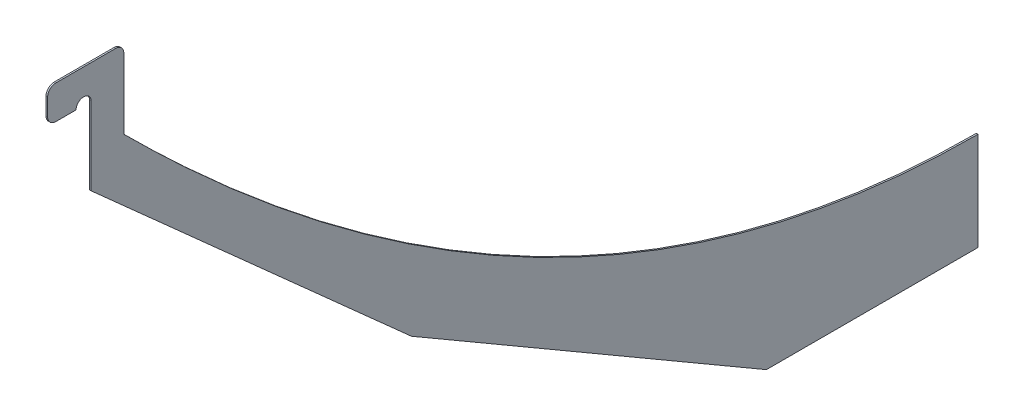
ISO-10303-21;
HEADER;
FILE_DESCRIPTION(('STEP AP214'),'2;1');
FILE_NAME('part.step','',(''),(''),'','','');
FILE_SCHEMA(('AUTOMOTIVE_DESIGN { 1 0 10303 214 1 1 1 1 }'));
ENDSEC;
DATA;
#1=APPLICATION_CONTEXT('core data for automotive mechanical design processes');
#2=APPLICATION_PROTOCOL_DEFINITION('international standard','automotive_design',2000,#1);
#3=PRODUCT_CONTEXT('',#1,'mechanical');
#4=PRODUCT('Part','Part','',(#3));
#5=PRODUCT_RELATED_PRODUCT_CATEGORY('part','',(#4));
#6=PRODUCT_DEFINITION_FORMATION('','',#4);
#7=PRODUCT_DEFINITION_CONTEXT('part definition',#1,'design');
#8=PRODUCT_DEFINITION('design','',#6,#7);
#9=PRODUCT_DEFINITION_SHAPE('','',#8);
#10=(LENGTH_UNIT() NAMED_UNIT(*) SI_UNIT(.MILLI.,.METRE.));
#11=(NAMED_UNIT(*) PLANE_ANGLE_UNIT() SI_UNIT($,.RADIAN.));
#12=(NAMED_UNIT(*) SI_UNIT($,.STERADIAN.) SOLID_ANGLE_UNIT());
#13=UNCERTAINTY_MEASURE_WITH_UNIT(LENGTH_MEASURE(1.E-05),#10,'distance_accuracy_value','');
#14=(GEOMETRIC_REPRESENTATION_CONTEXT(3) GLOBAL_UNCERTAINTY_ASSIGNED_CONTEXT((#13)) GLOBAL_UNIT_ASSIGNED_CONTEXT((#10,
#11,#12)) REPRESENTATION_CONTEXT('',''));
#15=CARTESIAN_POINT('',(0.,0.,0.));
#16=DIRECTION('',(0.,0.,1.));
#17=DIRECTION('',(1.,0.,0.));
#18=AXIS2_PLACEMENT_3D('',#15,#16,#17);
#19=CARTESIAN_POINT('',(2.54,999921.479894962,-51519.8250007155));
#20=CARTESIAN_POINT('',(2.54,-1000078.52392098,-0.0740675083079623));
#21=CARTESIAN_POINT('',(2.54,999921.47226306,51519.9731357321));
#22=B_SPLINE_CURVE_WITH_KNOTS('',2,(#19,#20,#21),.UNSPECIFIED.,.F.,.F.,(3,3),(0.,1.),.UNSPECIFIED.);
#23=DIRECTION('',(-1.,0.,0.));
#24=VECTOR('',#23,1.);
#25=SURFACE_OF_LINEAR_EXTRUSION('',#22,#24);
#26=CARTESIAN_POINT('',(0.,999921.479894962,-51519.8250007155));
#27=CARTESIAN_POINT('',(0.,-1000078.52392098,-0.0740675083079623));
#28=CARTESIAN_POINT('',(0.,999921.47226306,51519.9731357321));
#29=B_SPLINE_CURVE_WITH_KNOTS('',2,(#26,#27,#28),.UNSPECIFIED.,.F.,.F.,(3,3),(0.,1.),.UNSPECIFIED.);
#30=CARTESIAN_POINT('',(0.,-78.5239209863282,1.38664695723524E-05));
#31=VERTEX_POINT('',#30);
#32=CARTESIAN_POINT('',(0.,585.051089401089,1327.15015783543));
#33=VERTEX_POINT('',#32);
#34=EDGE_CURVE('E165',#31,#33,#29,.T.);
#35=ORIENTED_EDGE('',*,*,#34,.T.);
#36=DIRECTION('',(-1.,0.,0.));
#37=VECTOR('',#36,1.);
#38=CARTESIAN_POINT('',(2.54,585.051089401089,1327.15015783543));
#39=LINE('',#38,#37);
#40=CARTESIAN_POINT('',(2.54,585.051089401089,1327.15015783543));
#41=VERTEX_POINT('',#40);
#42=EDGE_CURVE('E11',#41,#33,#39,.T.);
#43=ORIENTED_EDGE('',*,*,#42,.F.);
#44=CARTESIAN_POINT('',(2.54,-78.5239209863282,1.38664695723524E-05));
#45=VERTEX_POINT('',#44);
#46=EDGE_CURVE('E196',#45,#41,#22,.T.);
#47=ORIENTED_EDGE('',*,*,#46,.F.);
#48=DIRECTION('',(-1.,0.,0.));
#49=VECTOR('',#48,1.);
#50=CARTESIAN_POINT('',(2.54,-78.5239209863282,1.38664695723524E-05));
#51=LINE('',#50,#49);
#52=EDGE_CURVE('E161',#45,#31,#51,.T.);
#53=ORIENTED_EDGE('',*,*,#52,.T.);
#54=EDGE_LOOP('',(#35,#43,#47,#53));
#55=FACE_BOUND('',#54,.T.);
#56=ADVANCED_FACE('F32',(#55),#25,.F.);
#57=CARTESIAN_POINT('',(2.54,694.252697447345,1327.14986438121));
#58=DIRECTION('',(0.,2.68727014754143E-06,0.999999999996389));
#59=DIRECTION('',(0.,-0.999999999996389,2.68727014754143E-06));
#60=AXIS2_PLACEMENT_3D('',#57,#58,#59);
#61=PLANE('',#60);
#62=DIRECTION('',(0.,0.999999999996389,-2.68727014754143E-06));
#63=VECTOR('',#62,1.);
#64=CARTESIAN_POINT('',(0.,694.252697447345,1327.14986438121));
#65=LINE('',#64,#63);
#66=CARTESIAN_POINT('',(0.,694.252697447345,1327.14986438121));
#67=VERTEX_POINT('',#66);
#68=EDGE_CURVE('E170',#33,#67,#65,.T.);
#69=ORIENTED_EDGE('',*,*,#68,.T.);
#70=DIRECTION('',(-1.,0.,0.));
#71=VECTOR('',#70,1.);
#72=CARTESIAN_POINT('',(2.54,694.252697447345,1327.14986438121));
#73=LINE('',#72,#71);
#74=CARTESIAN_POINT('',(2.54,694.252697447345,1327.14986438121));
#75=VERTEX_POINT('',#74);
#76=EDGE_CURVE('E41',#75,#67,#73,.T.);
#77=ORIENTED_EDGE('',*,*,#76,.F.);
#78=DIRECTION('',(0.,0.999999999996389,-2.68727014754143E-06));
#79=VECTOR('',#78,1.);
#80=CARTESIAN_POINT('',(2.54,694.252697447345,1327.14986438121));
#81=LINE('',#80,#79);
#82=EDGE_CURVE('E110',#41,#75,#81,.T.);
#83=ORIENTED_EDGE('',*,*,#82,.F.);
#84=ORIENTED_EDGE('',*,*,#42,.T.);
#85=EDGE_LOOP('',(#69,#77,#83,#84));
#86=FACE_BOUND('',#85,.T.);
#87=ADVANCED_FACE('F284',(#86),#61,.F.);
#88=CARTESIAN_POINT('',(2.54,694.252697248541,1339.84986731726));
#89=DIRECTION('',(-1.,0.,0.));
#90=DIRECTION('',(0.,0.,1.));
#91=AXIS2_PLACEMENT_3D('',#88,#89,#90);
#92=CYLINDRICAL_SURFACE('',#91,12.70000293605);
#93=CARTESIAN_POINT('',(0.,694.252697248541,1339.84986731726));
#94=DIRECTION('',(1.,0.,0.));
#95=DIRECTION('',(0.,0.,-1.));
#96=AXIS2_PLACEMENT_3D('',#93,#94,#95);
#97=CIRCLE('',#96,12.70000293605);
#98=CARTESIAN_POINT('',(0.,706.952700184591,1339.84986751607));
#99=VERTEX_POINT('',#98);
#100=EDGE_CURVE('E175',#67,#99,#97,.T.);
#101=ORIENTED_EDGE('',*,*,#100,.T.);
#102=DIRECTION('',(-1.,0.,0.));
#103=VECTOR('',#102,1.);
#104=CARTESIAN_POINT('',(2.54,706.952700184591,1339.84986751607));
#105=LINE('',#104,#103);
#106=CARTESIAN_POINT('',(2.54,706.952700184591,1339.84986751607));
#107=VERTEX_POINT('',#106);
#108=EDGE_CURVE('E221',#107,#99,#105,.T.);
#109=ORIENTED_EDGE('',*,*,#108,.F.);
#110=CARTESIAN_POINT('',(2.54,694.252697248541,1339.84986731726));
#111=DIRECTION('',(1.,0.,0.));
#112=DIRECTION('',(0.,0.,-1.));
#113=AXIS2_PLACEMENT_3D('',#110,#111,#112);
#114=CIRCLE('',#113,12.70000293605);
#115=EDGE_CURVE('E229',#75,#107,#114,.T.);
#116=ORIENTED_EDGE('',*,*,#115,.F.);
#117=ORIENTED_EDGE('',*,*,#76,.T.);
#118=EDGE_LOOP('',(#101,#109,#116,#117));
#119=FACE_BOUND('',#118,.T.);
#120=ADVANCED_FACE('F227',(#119),#92,.T.);
#121=CARTESIAN_POINT('',(2.54,706.952700184591,1339.84986751607));
#122=DIRECTION('',(0.,-1.,-1.56538735143038E-08));
#123=DIRECTION('',(0.,1.56538735143038E-08,-1.));
#124=AXIS2_PLACEMENT_3D('',#121,#122,#123);
#125=PLANE('',#124);
#126=DIRECTION('',(0.,-1.56538735143038E-08,1.));
#127=VECTOR('',#126,1.);
#128=CARTESIAN_POINT('',(0.,706.952700184591,1339.84986751607));
#129=LINE('',#128,#127);
#130=CARTESIAN_POINT('',(0.,706.952698728424,1432.8726559943));
#131=VERTEX_POINT('',#130);
#132=EDGE_CURVE('E177',#99,#131,#129,.T.);
#133=ORIENTED_EDGE('',*,*,#132,.T.);
#134=DIRECTION('',(-1.,0.,0.));
#135=VECTOR('',#134,1.);
#136=CARTESIAN_POINT('',(2.54,706.952698728424,1432.8726559943));
#137=LINE('',#136,#135);
#138=CARTESIAN_POINT('',(2.54,706.952698728424,1432.8726559943));
#139=VERTEX_POINT('',#138);
#140=EDGE_CURVE('E218',#139,#131,#137,.T.);
#141=ORIENTED_EDGE('',*,*,#140,.F.);
#142=DIRECTION('',(0.,-1.56538735143038E-08,1.));
#143=VECTOR('',#142,1.);
#144=CARTESIAN_POINT('',(2.54,706.952700184591,1339.84986751607));
#145=LINE('',#144,#143);
#146=EDGE_CURVE('E247',#107,#139,#145,.T.);
#147=ORIENTED_EDGE('',*,*,#146,.F.);
#148=ORIENTED_EDGE('',*,*,#108,.T.);
#149=EDGE_LOOP('',(#133,#141,#147,#148));
#150=FACE_BOUND('',#149,.T.);
#151=ADVANCED_FACE('F238',(#150),#125,.F.);
#152=CARTESIAN_POINT('',(2.54,694.252698728424,1432.8726557955));
#153=DIRECTION('',(-1.,0.,0.));
#154=DIRECTION('',(0.,0.,1.));
#155=AXIS2_PLACEMENT_3D('',#152,#153,#154);
#156=CYLINDRICAL_SURFACE('',#155,12.6999999999999);
#157=CARTESIAN_POINT('',(0.,694.252698728424,1432.8726557955));
#158=DIRECTION('',(1.,0.,0.));
#159=DIRECTION('',(0.,0.,-1.));
#160=AXIS2_PLACEMENT_3D('',#157,#158,#159);
#161=CIRCLE('',#160,12.6999999999999);
#162=CARTESIAN_POINT('',(0.,694.25269852962,1445.5726557955));
#163=VERTEX_POINT('',#162);
#164=EDGE_CURVE('E179',#131,#163,#161,.T.);
#165=ORIENTED_EDGE('',*,*,#164,.T.);
#166=DIRECTION('',(-1.,0.,0.));
#167=VECTOR('',#166,1.);
#168=CARTESIAN_POINT('',(2.54,694.25269852962,1445.5726557955));
#169=LINE('',#168,#167);
#170=CARTESIAN_POINT('',(2.54,694.25269852962,1445.5726557955));
#171=VERTEX_POINT('',#170);
#172=EDGE_CURVE('E215',#171,#163,#169,.T.);
#173=ORIENTED_EDGE('',*,*,#172,.F.);
#174=CARTESIAN_POINT('',(2.54,694.252698728424,1432.8726557955));
#175=DIRECTION('',(1.,0.,0.));
#176=DIRECTION('',(0.,0.,-1.));
#177=AXIS2_PLACEMENT_3D('',#174,#175,#176);
#178=CIRCLE('',#177,12.6999999999999);
#179=EDGE_CURVE('E244',#139,#171,#178,.T.);
#180=ORIENTED_EDGE('',*,*,#179,.F.);
#181=ORIENTED_EDGE('',*,*,#140,.T.);
#182=EDGE_LOOP('',(#165,#173,#180,#181));
#183=FACE_BOUND('',#182,.T.);
#184=ADVANCED_FACE('F242',(#183),#156,.T.);
#185=CARTESIAN_POINT('',(2.54,694.25269852962,1445.5726557955));
#186=DIRECTION('',(0.,1.56538749833504E-08,-1.));
#187=DIRECTION('',(0.,1.,1.56538749833504E-08));
#188=AXIS2_PLACEMENT_3D('',#185,#186,#187);
#189=PLANE('',#188);
#190=DIRECTION('',(0.,-1.,-1.56538749833504E-08));
#191=VECTOR('',#190,1.);
#192=CARTESIAN_POINT('',(0.,694.25269852962,1445.5726557955));
#193=LINE('',#192,#191);
#194=CARTESIAN_POINT('',(0.,667.601090483369,1445.57265537829));
#195=VERTEX_POINT('',#194);
#196=EDGE_CURVE('E181',#163,#195,#193,.T.);
#197=ORIENTED_EDGE('',*,*,#196,.T.);
#198=DIRECTION('',(-1.,0.,0.));
#199=VECTOR('',#198,1.);
#200=CARTESIAN_POINT('',(2.54,667.601090483369,1445.57265537829));
#201=LINE('',#200,#199);
#202=CARTESIAN_POINT('',(2.54,667.601090483369,1445.57265537829));
#203=VERTEX_POINT('',#202);
#204=EDGE_CURVE('E212',#203,#195,#201,.T.);
#205=ORIENTED_EDGE('',*,*,#204,.F.);
#206=DIRECTION('',(0.,-1.,-1.56538749833504E-08));
#207=VECTOR('',#206,1.);
#208=CARTESIAN_POINT('',(2.54,694.25269852962,1445.5726557955));
#209=LINE('',#208,#207);
#210=EDGE_CURVE('E246',#171,#203,#209,.T.);
#211=ORIENTED_EDGE('',*,*,#210,.F.);
#212=ORIENTED_EDGE('',*,*,#172,.T.);
#213=EDGE_LOOP('',(#197,#205,#211,#212));
#214=FACE_BOUND('',#213,.T.);
#215=ADVANCED_FACE('F297',(#214),#189,.F.);
#216=CARTESIAN_POINT('',(2.54,667.601090682173,1432.87265537829));
#217=DIRECTION('',(-1.,0.,0.));
#218=DIRECTION('',(0.,0.,1.));
#219=AXIS2_PLACEMENT_3D('',#216,#217,#218);
#220=CYLINDRICAL_SURFACE('',#219,12.6999999999999);
#221=CARTESIAN_POINT('',(0.,667.601090682173,1432.87265537829));
#222=DIRECTION('',(1.,0.,0.));
#223=DIRECTION('',(0.,0.,-1.));
#224=AXIS2_PLACEMENT_3D('',#221,#222,#223);
#225=CIRCLE('',#224,12.6999999999999);
#226=CARTESIAN_POINT('',(0.,654.901090682173,1432.87265517949));
#227=VERTEX_POINT('',#226);
#228=EDGE_CURVE('E183',#195,#227,#225,.T.);
#229=ORIENTED_EDGE('',*,*,#228,.T.);
#230=DIRECTION('',(-1.,0.,0.));
#231=VECTOR('',#230,1.);
#232=CARTESIAN_POINT('',(2.54,654.901090682173,1432.87265517949));
#233=LINE('',#232,#231);
#234=CARTESIAN_POINT('',(2.54,654.901090682173,1432.87265517949));
#235=VERTEX_POINT('',#234);
#236=EDGE_CURVE('E209',#235,#227,#233,.T.);
#237=ORIENTED_EDGE('',*,*,#236,.F.);
#238=CARTESIAN_POINT('',(2.54,667.601090682173,1432.87265537829));
#239=DIRECTION('',(1.,0.,0.));
#240=DIRECTION('',(0.,0.,-1.));
#241=AXIS2_PLACEMENT_3D('',#238,#239,#240);
#242=CIRCLE('',#241,12.6999999999999);
#243=EDGE_CURVE('E249',#203,#235,#242,.T.);
#244=ORIENTED_EDGE('',*,*,#243,.F.);
#245=ORIENTED_EDGE('',*,*,#204,.T.);
#246=EDGE_LOOP('',(#229,#237,#244,#245));
#247=FACE_BOUND('',#246,.T.);
#248=ADVANCED_FACE('F300',(#247),#220,.T.);
#249=CARTESIAN_POINT('',(2.54,654.901090682173,1432.87265517949));
#250=DIRECTION('',(0.,1.,1.56538721367372E-08));
#251=DIRECTION('',(0.,-1.56538721367372E-08,1.));
#252=AXIS2_PLACEMENT_3D('',#249,#250,#251);
#253=PLANE('',#252);
#254=DIRECTION('',(0.,1.56538721367372E-08,-1.));
#255=VECTOR('',#254,1.);
#256=CARTESIAN_POINT('',(0.,654.901090682173,1432.87265517949));
#257=LINE('',#256,#255);
#258=CARTESIAN_POINT('',(0.,654.901091175332,1401.36867412778));
#259=VERTEX_POINT('',#258);
#260=EDGE_CURVE('E185',#227,#259,#257,.T.);
#261=ORIENTED_EDGE('',*,*,#260,.T.);
#262=DIRECTION('',(-1.,0.,0.));
#263=VECTOR('',#262,1.);
#264=CARTESIAN_POINT('',(2.54,654.901091175332,1401.36867412778));
#265=LINE('',#264,#263);
#266=CARTESIAN_POINT('',(2.54,654.901091175332,1401.36867412778));
#267=VERTEX_POINT('',#266);
#268=EDGE_CURVE('E206',#267,#259,#265,.T.);
#269=ORIENTED_EDGE('',*,*,#268,.F.);
#270=DIRECTION('',(0.,1.56538721367372E-08,-1.));
#271=VECTOR('',#270,1.);
#272=CARTESIAN_POINT('',(2.54,654.901090682173,1432.87265517949));
#273=LINE('',#272,#271);
#274=EDGE_CURVE('E255',#235,#267,#273,.T.);
#275=ORIENTED_EDGE('',*,*,#274,.F.);
#276=ORIENTED_EDGE('',*,*,#236,.T.);
#277=EDGE_LOOP('',(#261,#269,#275,#276));
#278=FACE_BOUND('',#277,.T.);
#279=ADVANCED_FACE('F304',(#278),#253,.F.);
#280=CARTESIAN_POINT('',(2.54,654.90108830767,1389.65927412778));
#281=DIRECTION('',(-1.,0.,0.));
#282=DIRECTION('',(0.,0.,1.));
#283=AXIS2_PLACEMENT_3D('',#280,#281,#282);
#284=CYLINDRICAL_SURFACE('',#283,11.7093999999999);
#285=CARTESIAN_POINT('',(0.,654.90108830767,1389.65927412778));
#286=DIRECTION('',(-1.,0.,0.));
#287=DIRECTION('',(0.,0.,-1.));
#288=AXIS2_PLACEMENT_3D('',#285,#286,#287);
#289=CIRCLE('',#288,11.7093999999999);
#290=CARTESIAN_POINT('',(0.,654.90108830767,1377.94987412778));
#291=VERTEX_POINT('',#290);
#292=EDGE_CURVE('E187',#259,#291,#289,.T.);
#293=ORIENTED_EDGE('',*,*,#292,.T.);
#294=DIRECTION('',(-1.,0.,0.));
#295=VECTOR('',#294,1.);
#296=CARTESIAN_POINT('',(2.54,654.90108830767,1377.94987412778));
#297=LINE('',#296,#295);
#298=CARTESIAN_POINT('',(2.54,654.90108830767,1377.94987412778));
#299=VERTEX_POINT('',#298);
#300=EDGE_CURVE('E203',#299,#291,#297,.T.);
#301=ORIENTED_EDGE('',*,*,#300,.F.);
#302=CARTESIAN_POINT('',(2.54,654.90108830767,1389.65927412778));
#303=DIRECTION('',(-1.,0.,0.));
#304=DIRECTION('',(0.,0.,-1.));
#305=AXIS2_PLACEMENT_3D('',#302,#303,#304);
#306=CIRCLE('',#305,11.7093999999999);
#307=EDGE_CURVE('E257',#267,#299,#306,.T.);
#308=ORIENTED_EDGE('',*,*,#307,.F.);
#309=ORIENTED_EDGE('',*,*,#268,.T.);
#310=EDGE_LOOP('',(#293,#301,#308,#309));
#311=FACE_BOUND('',#310,.T.);
#312=ADVANCED_FACE('F308',(#311),#284,.F.);
#313=CARTESIAN_POINT('',(2.54,654.90108830767,1377.94987412778));
#314=DIRECTION('',(0.,0.,-1.));
#315=DIRECTION('',(-1.,0.,0.));
#316=AXIS2_PLACEMENT_3D('',#313,#314,#315);
#317=PLANE('',#316);
#318=DIRECTION('',(0.,-1.,0.));
#319=VECTOR('',#318,1.);
#320=CARTESIAN_POINT('',(0.,654.90108830767,1377.94987412778));
#321=LINE('',#320,#319);
#322=CARTESIAN_POINT('',(0.,534.251091161392,1377.94987412778));
#323=VERTEX_POINT('',#322);
#324=EDGE_CURVE('E189',#291,#323,#321,.T.);
#325=ORIENTED_EDGE('',*,*,#324,.T.);
#326=DIRECTION('',(-1.,0.,0.));
#327=VECTOR('',#326,1.);
#328=CARTESIAN_POINT('',(2.54,534.251091161392,1377.94987412778));
#329=LINE('',#328,#327);
#330=CARTESIAN_POINT('',(2.54,534.251091161392,1377.94987412778));
#331=VERTEX_POINT('',#330);
#332=EDGE_CURVE('E200',#331,#323,#329,.T.);
#333=ORIENTED_EDGE('',*,*,#332,.F.);
#334=DIRECTION('',(0.,-1.,0.));
#335=VECTOR('',#334,1.);
#336=CARTESIAN_POINT('',(2.54,654.90108830767,1377.94987412778));
#337=LINE('',#336,#335);
#338=EDGE_CURVE('E259',#299,#331,#337,.T.);
#339=ORIENTED_EDGE('',*,*,#338,.F.);
#340=ORIENTED_EDGE('',*,*,#300,.T.);
#341=EDGE_LOOP('',(#325,#333,#339,#340));
#342=FACE_BOUND('',#341,.T.);
#343=ADVANCED_FACE('F265',(#342),#317,.F.);
#344=CARTESIAN_POINT('',(2.54,534.251091161392,1377.94987412778));
#345=DIRECTION('',(0.,0.745840023279207,-0.666125108125247));
#346=DIRECTION('',(0.,0.666125108125247,0.745840023279207));
#347=AXIS2_PLACEMENT_3D('',#344,#345,#346);
#348=PLANE('',#347);
#349=DIRECTION('',(0.,-0.666125108125247,-0.745840023279207));
#350=VECTOR('',#349,1.);
#351=CARTESIAN_POINT('',(0.,534.251091161392,1377.94987412778));
#352=LINE('',#351,#350);
#353=CARTESIAN_POINT('',(0.,89.8626852796164,880.381692197677));
#354=VERTEX_POINT('',#353);
#355=EDGE_CURVE('E191',#323,#354,#352,.T.);
#356=ORIENTED_EDGE('',*,*,#355,.T.);
#357=DIRECTION('',(-1.,0.,0.));
#358=VECTOR('',#357,1.);
#359=CARTESIAN_POINT('',(2.54,89.8626852796164,880.381692197677));
#360=LINE('',#359,#358);
#361=CARTESIAN_POINT('',(2.54,89.8626852796164,880.381692197677));
#362=VERTEX_POINT('',#361);
#363=EDGE_CURVE('E156',#362,#354,#360,.T.);
#364=ORIENTED_EDGE('',*,*,#363,.F.);
#365=DIRECTION('',(0.,-0.666125108125247,-0.745840023279207));
#366=VECTOR('',#365,1.);
#367=CARTESIAN_POINT('',(2.54,534.251091161392,1377.94987412778));
#368=LINE('',#367,#366);
#369=EDGE_CURVE('E147',#331,#362,#368,.T.);
#370=ORIENTED_EDGE('',*,*,#369,.F.);
#371=ORIENTED_EDGE('',*,*,#332,.T.);
#372=EDGE_LOOP('',(#356,#364,#370,#371));
#373=FACE_BOUND('',#372,.T.);
#374=ADVANCED_FACE('F269',(#373),#348,.F.);
#375=CARTESIAN_POINT('',(2.54,-230.92393770825,328.770779224495));
#376=DIRECTION('',(0.,0.864450932066101,-0.502717202858675));
#377=DIRECTION('',(0.,0.502717202858675,0.864450932066101));
#378=AXIS2_PLACEMENT_3D('',#375,#376,#377);
#379=PLANE('',#378);
#380=DIRECTION('',(0.,-0.502717202858675,-0.864450932066101));
#381=VECTOR('',#380,1.);
#382=CARTESIAN_POINT('',(0.,-230.92393770825,328.770779224495));
#383=LINE('',#382,#381);
#384=CARTESIAN_POINT('',(0.,-230.92393770825,328.770779224495));
#385=VERTEX_POINT('',#384);
#386=EDGE_CURVE('E155',#354,#385,#383,.T.);
#387=ORIENTED_EDGE('',*,*,#386,.T.);
#388=DIRECTION('',(-1.,0.,0.));
#389=VECTOR('',#388,1.);
#390=CARTESIAN_POINT('',(2.54,-230.92393770825,328.770779224495));
#391=LINE('',#390,#389);
#392=CARTESIAN_POINT('',(2.54,-230.92393770825,328.770779224495));
#393=VERTEX_POINT('',#392);
#394=EDGE_CURVE('E152',#393,#385,#391,.T.);
#395=ORIENTED_EDGE('',*,*,#394,.F.);
#396=DIRECTION('',(0.,-0.502717202858675,-0.864450932066101));
#397=VECTOR('',#396,1.);
#398=CARTESIAN_POINT('',(2.54,-230.92393770825,328.770779224495));
#399=LINE('',#398,#397);
#400=EDGE_CURVE('E141',#362,#393,#399,.T.);
#401=ORIENTED_EDGE('',*,*,#400,.F.);
#402=ORIENTED_EDGE('',*,*,#363,.T.);
#403=EDGE_LOOP('',(#387,#395,#401,#402));
#404=FACE_BOUND('',#403,.T.);
#405=ADVANCED_FACE('F153',(#404),#379,.F.);
#406=CARTESIAN_POINT('',(2.54,-230.92393770825,328.770779224495));
#407=DIRECTION('',(0.,1.,0.));
#408=DIRECTION('',(0.,0.,1.));
#409=AXIS2_PLACEMENT_3D('',#406,#407,#408);
#410=PLANE('',#409);
#411=DIRECTION('',(0.,0.,-1.));
#412=VECTOR('',#411,1.);
#413=CARTESIAN_POINT('',(0.,-230.92393770825,328.770779224495));
#414=LINE('',#413,#412);
#415=CARTESIAN_POINT('',(0.,-230.92393770825,1.38665916395639E-05));
#416=VERTEX_POINT('',#415);
#417=EDGE_CURVE('E96',#385,#416,#414,.T.);
#418=ORIENTED_EDGE('',*,*,#417,.T.);
#419=DIRECTION('',(-1.,0.,0.));
#420=VECTOR('',#419,1.);
#421=CARTESIAN_POINT('',(2.54,-230.92393770825,1.38665916395639E-05));
#422=LINE('',#421,#420);
#423=CARTESIAN_POINT('',(2.54,-230.92393770825,1.38665916395639E-05));
#424=VERTEX_POINT('',#423);
#425=EDGE_CURVE('E157',#424,#416,#422,.T.);
#426=ORIENTED_EDGE('',*,*,#425,.F.);
#427=DIRECTION('',(0.,0.,-1.));
#428=VECTOR('',#427,1.);
#429=CARTESIAN_POINT('',(2.54,-230.92393770825,328.770779224495));
#430=LINE('',#429,#428);
#431=EDGE_CURVE('E145',#393,#424,#430,.T.);
#432=ORIENTED_EDGE('',*,*,#431,.F.);
#433=ORIENTED_EDGE('',*,*,#394,.T.);
#434=EDGE_LOOP('',(#418,#426,#432,#433));
#435=FACE_BOUND('',#434,.T.);
#436=ADVANCED_FACE('F159',(#435),#410,.F.);
#437=CARTESIAN_POINT('',(2.54,-230.92393770825,1.38665916395639E-05));
#438=DIRECTION('',(0.,8.00965866857172E-13,1.));
#439=DIRECTION('',(0.,-1.,8.00965866857172E-13));
#440=AXIS2_PLACEMENT_3D('',#437,#438,#439);
#441=PLANE('',#440);
#442=DIRECTION('',(0.,1.,-8.00965866857172E-13));
#443=VECTOR('',#442,1.);
#444=CARTESIAN_POINT('',(0.,-230.92393770825,1.38665916395639E-05));
#445=LINE('',#444,#443);
#446=EDGE_CURVE('E102',#416,#31,#445,.T.);
#447=ORIENTED_EDGE('',*,*,#446,.T.);
#448=ORIENTED_EDGE('',*,*,#52,.F.);
#449=DIRECTION('',(0.,1.,-8.00965866857172E-13));
#450=VECTOR('',#449,1.);
#451=CARTESIAN_POINT('',(2.54,-230.92393770825,1.38665916395639E-05));
#452=LINE('',#451,#450);
#453=EDGE_CURVE('E49',#424,#45,#452,.T.);
#454=ORIENTED_EDGE('',*,*,#453,.F.);
#455=ORIENTED_EDGE('',*,*,#425,.T.);
#456=EDGE_LOOP('',(#447,#448,#454,#455));
#457=FACE_BOUND('',#456,.T.);
#458=ADVANCED_FACE('F273',(#457),#441,.F.);
#459=CARTESIAN_POINT('',(2.54,-78.5239209863278,0.));
#460=DIRECTION('',(1.,0.,0.));
#461=DIRECTION('',(0.,0.,-1.));
#462=AXIS2_PLACEMENT_3D('',#459,#460,#461);
#463=PLANE('',#462);
#464=ORIENTED_EDGE('',*,*,#46,.T.);
#465=ORIENTED_EDGE('',*,*,#82,.T.);
#466=ORIENTED_EDGE('',*,*,#115,.T.);
#467=ORIENTED_EDGE('',*,*,#146,.T.);
#468=ORIENTED_EDGE('',*,*,#179,.T.);
#469=ORIENTED_EDGE('',*,*,#210,.T.);
#470=ORIENTED_EDGE('',*,*,#243,.T.);
#471=ORIENTED_EDGE('',*,*,#274,.T.);
#472=ORIENTED_EDGE('',*,*,#307,.T.);
#473=ORIENTED_EDGE('',*,*,#338,.T.);
#474=ORIENTED_EDGE('',*,*,#369,.T.);
#475=ORIENTED_EDGE('',*,*,#400,.T.);
#476=ORIENTED_EDGE('',*,*,#431,.T.);
#477=ORIENTED_EDGE('',*,*,#453,.T.);
#478=EDGE_LOOP('',(#464,#465,#466,#467,#468,#469,#470,#471,#472,#473,#474,#475,#476,#477));
#479=FACE_BOUND('',#478,.T.);
#480=ADVANCED_FACE('F143',(#479),#463,.T.);
#481=CARTESIAN_POINT('',(0.,-78.5239209863278,0.));
#482=DIRECTION('',(1.,0.,0.));
#483=DIRECTION('',(0.,0.,-1.));
#484=AXIS2_PLACEMENT_3D('',#481,#482,#483);
#485=PLANE('',#484);
#486=ORIENTED_EDGE('',*,*,#34,.F.);
#487=ORIENTED_EDGE('',*,*,#446,.F.);
#488=ORIENTED_EDGE('',*,*,#417,.F.);
#489=ORIENTED_EDGE('',*,*,#386,.F.);
#490=ORIENTED_EDGE('',*,*,#355,.F.);
#491=ORIENTED_EDGE('',*,*,#324,.F.);
#492=ORIENTED_EDGE('',*,*,#292,.F.);
#493=ORIENTED_EDGE('',*,*,#260,.F.);
#494=ORIENTED_EDGE('',*,*,#228,.F.);
#495=ORIENTED_EDGE('',*,*,#196,.F.);
#496=ORIENTED_EDGE('',*,*,#164,.F.);
#497=ORIENTED_EDGE('',*,*,#132,.F.);
#498=ORIENTED_EDGE('',*,*,#100,.F.);
#499=ORIENTED_EDGE('',*,*,#68,.F.);
#500=EDGE_LOOP('',(#486,#487,#488,#489,#490,#491,#492,#493,#494,#495,#496,#497,#498,#499));
#501=FACE_BOUND('',#500,.T.);
#502=ADVANCED_FACE('F233',(#501),#485,.F.);
#503=CLOSED_SHELL('',(#56,#87,#120,#151,#184,#215,#248,#279,#312,#343,#374,#405,#436,#458,#480,#502));
#504=MANIFOLD_SOLID_BREP('B2',#503);
#505=ADVANCED_BREP_SHAPE_REPRESENTATION('',(#18,#504),#14);
#506=SHAPE_DEFINITION_REPRESENTATION(#9,#505);
ENDSEC;
END-ISO-10303-21;
